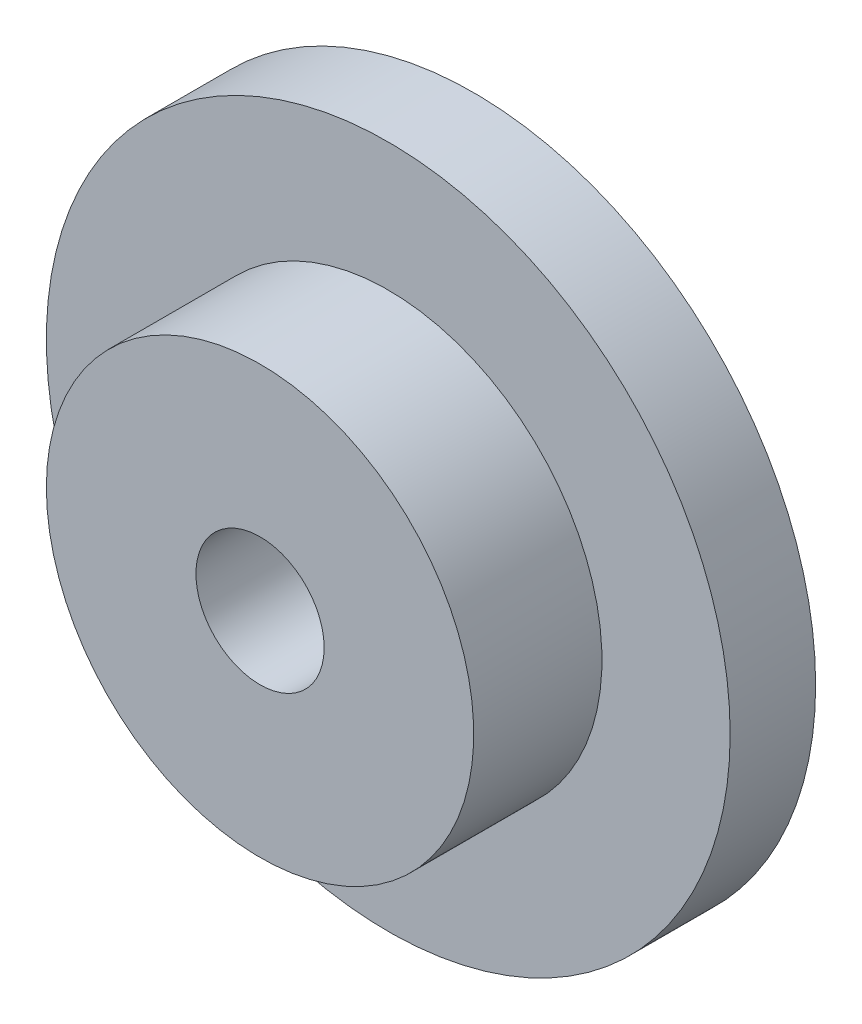
ISO-10303-21;
HEADER;
FILE_DESCRIPTION(('STEP AP214'),'2;1');
FILE_NAME('part.step','',(''),(''),'','','');
FILE_SCHEMA(('AUTOMOTIVE_DESIGN { 1 0 10303 214 1 1 1 1 }'));
ENDSEC;
DATA;
#1=APPLICATION_CONTEXT('core data for automotive mechanical design processes');
#2=APPLICATION_PROTOCOL_DEFINITION('international standard','automotive_design',2000,#1);
#3=PRODUCT_CONTEXT('',#1,'mechanical');
#4=PRODUCT('Part','Part','',(#3));
#5=PRODUCT_RELATED_PRODUCT_CATEGORY('part','',(#4));
#6=PRODUCT_DEFINITION_FORMATION('','',#4);
#7=PRODUCT_DEFINITION_CONTEXT('part definition',#1,'design');
#8=PRODUCT_DEFINITION('design','',#6,#7);
#9=PRODUCT_DEFINITION_SHAPE('','',#8);
#10=(LENGTH_UNIT() NAMED_UNIT(*) SI_UNIT(.MILLI.,.METRE.));
#11=(NAMED_UNIT(*) PLANE_ANGLE_UNIT() SI_UNIT($,.RADIAN.));
#12=(NAMED_UNIT(*) SI_UNIT($,.STERADIAN.) SOLID_ANGLE_UNIT());
#13=UNCERTAINTY_MEASURE_WITH_UNIT(LENGTH_MEASURE(1.E-05),#10,'distance_accuracy_value','');
#14=(GEOMETRIC_REPRESENTATION_CONTEXT(3) GLOBAL_UNCERTAINTY_ASSIGNED_CONTEXT((#13)) GLOBAL_UNIT_ASSIGNED_CONTEXT((#10,
#11,#12)) REPRESENTATION_CONTEXT('',''));
#15=CARTESIAN_POINT('',(0.,0.,0.));
#16=DIRECTION('',(0.,0.,1.));
#17=DIRECTION('',(1.,0.,0.));
#18=AXIS2_PLACEMENT_3D('',#15,#16,#17);
#19=CARTESIAN_POINT('',(0.,0.,6.35));
#20=DIRECTION('',(0.,0.,1.));
#21=DIRECTION('',(1.,0.,0.));
#22=AXIS2_PLACEMENT_3D('',#19,#20,#21);
#23=PLANE('',#22);
#24=CARTESIAN_POINT('',(0.,0.,6.35));
#25=DIRECTION('',(0.,0.,1.));
#26=DIRECTION('',(1.,0.,0.));
#27=AXIS2_PLACEMENT_3D('',#24,#25,#26);
#28=CIRCLE('',#27,25.4);
#29=CARTESIAN_POINT('',(25.4,0.,6.35));
#30=VERTEX_POINT('',#29);
#31=EDGE_CURVE('E10',#30,#30,#28,.T.);
#32=ORIENTED_EDGE('',*,*,#31,.T.);
#33=EDGE_LOOP('',(#32));
#34=FACE_BOUND('',#33,.T.);
#35=CARTESIAN_POINT('',(0.,0.,6.35));
#36=DIRECTION('',(0.,0.,1.));
#37=DIRECTION('',(1.,0.,0.));
#38=AXIS2_PLACEMENT_3D('',#35,#36,#37);
#39=CIRCLE('',#38,15.875);
#40=CARTESIAN_POINT('',(-15.875,0.,6.35));
#41=VERTEX_POINT('',#40);
#42=EDGE_CURVE('E43',#41,#41,#39,.T.);
#43=ORIENTED_EDGE('',*,*,#42,.F.);
#44=EDGE_LOOP('',(#43));
#45=FACE_BOUND('',#44,.T.);
#46=ADVANCED_FACE('F30',(#34,#45),#23,.T.);
#47=CARTESIAN_POINT('',(0.,0.,6.35));
#48=DIRECTION('',(0.,0.,-1.));
#49=DIRECTION('',(-1.,0.,0.));
#50=AXIS2_PLACEMENT_3D('',#47,#48,#49);
#51=CYLINDRICAL_SURFACE('',#50,25.4);
#52=ORIENTED_EDGE('',*,*,#31,.F.);
#53=EDGE_LOOP('',(#52));
#54=FACE_BOUND('',#53,.T.);
#55=CARTESIAN_POINT('',(0.,0.,0.));
#56=DIRECTION('',(0.,0.,1.));
#57=DIRECTION('',(1.,0.,0.));
#58=AXIS2_PLACEMENT_3D('',#55,#56,#57);
#59=CIRCLE('',#58,25.4);
#60=CARTESIAN_POINT('',(25.4,0.,0.));
#61=VERTEX_POINT('',#60);
#62=EDGE_CURVE('E34',#61,#61,#59,.T.);
#63=ORIENTED_EDGE('',*,*,#62,.T.);
#64=EDGE_LOOP('',(#63));
#65=FACE_BOUND('',#64,.T.);
#66=ADVANCED_FACE('F32',(#54,#65),#51,.T.);
#67=CARTESIAN_POINT('',(0.,0.,0.));
#68=DIRECTION('',(0.,0.,1.));
#69=DIRECTION('',(1.,0.,0.));
#70=AXIS2_PLACEMENT_3D('',#67,#68,#69);
#71=PLANE('',#70);
#72=CARTESIAN_POINT('',(0.,0.,0.));
#73=DIRECTION('',(0.,0.,1.));
#74=DIRECTION('',(1.,0.,0.));
#75=AXIS2_PLACEMENT_3D('',#72,#73,#74);
#76=CIRCLE('',#75,4.7625);
#77=CARTESIAN_POINT('',(4.7625,0.,0.));
#78=VERTEX_POINT('',#77);
#79=EDGE_CURVE('E46',#78,#78,#76,.F.);
#80=ORIENTED_EDGE('',*,*,#79,.F.);
#81=EDGE_LOOP('',(#80));
#82=FACE_BOUND('',#81,.T.);
#83=ORIENTED_EDGE('',*,*,#62,.F.);
#84=EDGE_LOOP('',(#83));
#85=FACE_BOUND('',#84,.T.);
#86=ADVANCED_FACE('F66',(#82,#85),#71,.F.);
#87=CARTESIAN_POINT('',(0.,0.,15.875));
#88=DIRECTION('',(0.,0.,-1.));
#89=DIRECTION('',(-1.,0.,0.));
#90=AXIS2_PLACEMENT_3D('',#87,#88,#89);
#91=CYLINDRICAL_SURFACE('',#90,15.875);
#92=CARTESIAN_POINT('',(0.,0.,15.875));
#93=DIRECTION('',(0.,0.,1.));
#94=DIRECTION('',(1.,0.,0.));
#95=AXIS2_PLACEMENT_3D('',#92,#93,#94);
#96=CIRCLE('',#95,15.875);
#97=CARTESIAN_POINT('',(-15.875,0.,15.875));
#98=VERTEX_POINT('',#97);
#99=EDGE_CURVE('E41',#98,#98,#96,.T.);
#100=CARTESIAN_POINT('',(-15.875,0.,15.875));
#101=CARTESIAN_POINT('',(-15.875,0.,15.77578125));
#102=CARTESIAN_POINT('',(-15.875,0.,15.6765625));
#103=CARTESIAN_POINT('',(-15.875,0.,15.478125));
#104=CARTESIAN_POINT('',(-15.875,0.,15.37890625));
#105=CARTESIAN_POINT('',(-15.875,0.,15.18046875));
#106=CARTESIAN_POINT('',(-15.875,0.,15.08125));
#107=CARTESIAN_POINT('',(-15.875,0.,14.8828125));
#108=CARTESIAN_POINT('',(-15.875,0.,14.78359375));
#109=CARTESIAN_POINT('',(-15.875,0.,14.58515625));
#110=CARTESIAN_POINT('',(-15.875,0.,14.4859375));
#111=CARTESIAN_POINT('',(-15.875,0.,14.2875));
#112=CARTESIAN_POINT('',(-15.875,0.,14.18828125));
#113=CARTESIAN_POINT('',(-15.875,0.,13.98984375));
#114=CARTESIAN_POINT('',(-15.875,0.,13.890625));
#115=CARTESIAN_POINT('',(-15.875,0.,13.6921875));
#116=CARTESIAN_POINT('',(-15.875,0.,13.59296875));
#117=CARTESIAN_POINT('',(-15.875,0.,13.39453125));
#118=CARTESIAN_POINT('',(-15.875,0.,13.2953125));
#119=CARTESIAN_POINT('',(-15.875,0.,13.096875));
#120=CARTESIAN_POINT('',(-15.875,0.,12.99765625));
#121=CARTESIAN_POINT('',(-15.875,0.,12.79921875));
#122=CARTESIAN_POINT('',(-15.875,0.,12.7));
#123=CARTESIAN_POINT('',(-15.875,0.,12.5015625));
#124=CARTESIAN_POINT('',(-15.875,0.,12.40234375));
#125=CARTESIAN_POINT('',(-15.875,0.,12.20390625));
#126=CARTESIAN_POINT('',(-15.875,0.,12.1046875));
#127=CARTESIAN_POINT('',(-15.875,0.,11.90625));
#128=CARTESIAN_POINT('',(-15.875,0.,11.80703125));
#129=CARTESIAN_POINT('',(-15.875,0.,11.60859375));
#130=CARTESIAN_POINT('',(-15.875,0.,11.509375));
#131=CARTESIAN_POINT('',(-15.875,0.,11.3109375));
#132=CARTESIAN_POINT('',(-15.875,0.,11.21171875));
#133=CARTESIAN_POINT('',(-15.875,0.,11.01328125));
#134=CARTESIAN_POINT('',(-15.875,0.,10.9140625));
#135=CARTESIAN_POINT('',(-15.875,0.,10.715625));
#136=CARTESIAN_POINT('',(-15.875,0.,10.61640625));
#137=CARTESIAN_POINT('',(-15.875,0.,10.41796875));
#138=CARTESIAN_POINT('',(-15.875,0.,10.31875));
#139=CARTESIAN_POINT('',(-15.875,0.,10.1203125));
#140=CARTESIAN_POINT('',(-15.875,0.,10.02109375));
#141=CARTESIAN_POINT('',(-15.875,0.,9.82265625));
#142=CARTESIAN_POINT('',(-15.875,0.,9.7234375));
#143=CARTESIAN_POINT('',(-15.875,0.,9.525));
#144=CARTESIAN_POINT('',(-15.875,0.,9.42578125));
#145=CARTESIAN_POINT('',(-15.875,0.,9.22734375));
#146=CARTESIAN_POINT('',(-15.875,0.,9.128125));
#147=CARTESIAN_POINT('',(-15.875,0.,8.9296875));
#148=CARTESIAN_POINT('',(-15.875,0.,8.83046875));
#149=CARTESIAN_POINT('',(-15.875,0.,8.63203125));
#150=CARTESIAN_POINT('',(-15.875,0.,8.5328125));
#151=CARTESIAN_POINT('',(-15.875,0.,8.334375));
#152=CARTESIAN_POINT('',(-15.875,0.,8.23515625));
#153=CARTESIAN_POINT('',(-15.875,0.,8.03671875));
#154=CARTESIAN_POINT('',(-15.875,0.,7.9375));
#155=CARTESIAN_POINT('',(-15.875,0.,7.7390625));
#156=CARTESIAN_POINT('',(-15.875,0.,7.63984375));
#157=CARTESIAN_POINT('',(-15.875,0.,7.44140625));
#158=CARTESIAN_POINT('',(-15.875,0.,7.3421875));
#159=CARTESIAN_POINT('',(-15.875,0.,7.14375));
#160=CARTESIAN_POINT('',(-15.875,0.,7.04453125));
#161=CARTESIAN_POINT('',(-15.875,0.,6.84609375));
#162=CARTESIAN_POINT('',(-15.875,0.,6.746875));
#163=CARTESIAN_POINT('',(-15.875,0.,6.5484375));
#164=CARTESIAN_POINT('',(-15.875,0.,6.44921875));
#165=CARTESIAN_POINT('',(-15.875,0.,6.35));
#166=B_SPLINE_CURVE_WITH_KNOTS('',3,(#100,#101,#102,#103,#104,#105,#106,#107,#108,#109,#110,
#111,#112,#113,#114,#115,#116,#117,#118,#119,#120,#121,#122,#123,#124,#125,#126,#127,#128,#129,
#130,#131,#132,#133,#134,#135,#136,#137,#138,#139,#140,#141,#142,#143,#144,#145,#146,#147,#148,
#149,#150,#151,#152,#153,#154,#155,#156,#157,#158,#159,#160,#161,#162,#163,#164,#165),
.UNSPECIFIED.,.F.,.F.,(4,2,2,2,2,2,2,2,2,2,2,2,2,2,2,2,2,2,2,2,2,2,2,2,2,2,2,2,2,2,2,2,4),(0.,
0.297656249999998,0.595312499999999,0.892968749999999,1.190625,1.48828125,1.7859375,2.08359375,
2.38125,2.67890625,2.9765625,3.27421875,3.571875,3.86953125,4.1671875,4.46484375,4.7625,
5.06015625,5.3578125,5.65546875,5.953125,6.25078125,6.5484375,6.84609375,7.14375,7.44140625,
7.7390625,8.03671875,8.334375,8.63203125,8.9296875,9.22734375,9.525),.UNSPECIFIED.);
#167=EDGE_CURVE('BSEAM60',#98,#41,#166,.T.);
#168=ORIENTED_EDGE('',*,*,#99,.F.);
#169=ORIENTED_EDGE('',*,*,#42,.T.);
#170=ORIENTED_EDGE('',*,*,#167,.T.);
#171=ORIENTED_EDGE('',*,*,#167,.F.);
#172=EDGE_LOOP('',(#168,#170,#169,#171));
#173=FACE_BOUND('',#172,.T.);
#174=ADVANCED_FACE('F60',(#173),#91,.T.);
#175=CARTESIAN_POINT('',(0.,0.,15.875));
#176=DIRECTION('',(0.,0.,1.));
#177=DIRECTION('',(1.,0.,0.));
#178=AXIS2_PLACEMENT_3D('',#175,#176,#177);
#179=PLANE('',#178);
#180=CARTESIAN_POINT('',(0.,0.,15.875));
#181=DIRECTION('',(0.,0.,1.));
#182=DIRECTION('',(1.,0.,0.));
#183=AXIS2_PLACEMENT_3D('',#180,#181,#182);
#184=CIRCLE('',#183,4.7625);
#185=CARTESIAN_POINT('',(4.7625,0.,15.875));
#186=VERTEX_POINT('',#185);
#187=EDGE_CURVE('E51',#186,#186,#184,.T.);
#188=ORIENTED_EDGE('',*,*,#187,.F.);
#189=EDGE_LOOP('',(#188));
#190=FACE_BOUND('',#189,.T.);
#191=ORIENTED_EDGE('',*,*,#99,.T.);
#192=EDGE_LOOP('',(#191));
#193=FACE_BOUND('',#192,.T.);
#194=ADVANCED_FACE('F57',(#190,#193),#179,.T.);
#195=CARTESIAN_POINT('',(0.,0.,-13.4703841816037));
#196=DIRECTION('',(0.,0.,1.));
#197=DIRECTION('',(1.,0.,0.));
#198=AXIS2_PLACEMENT_3D('',#195,#196,#197);
#199=CYLINDRICAL_SURFACE('',#198,4.7625);
#200=ORIENTED_EDGE('',*,*,#79,.T.);
#201=EDGE_LOOP('',(#200));
#202=FACE_BOUND('',#201,.T.);
#203=ORIENTED_EDGE('',*,*,#187,.T.);
#204=EDGE_LOOP('',(#203));
#205=FACE_BOUND('',#204,.T.);
#206=ADVANCED_FACE('F55',(#202,#205),#199,.F.);
#207=CLOSED_SHELL('',(#46,#66,#86,#174,#194,#206));
#208=MANIFOLD_SOLID_BREP('B2',#207);
#209=ADVANCED_BREP_SHAPE_REPRESENTATION('',(#18,#208),#14);
#210=SHAPE_DEFINITION_REPRESENTATION(#9,#209);
ENDSEC;
END-ISO-10303-21;
